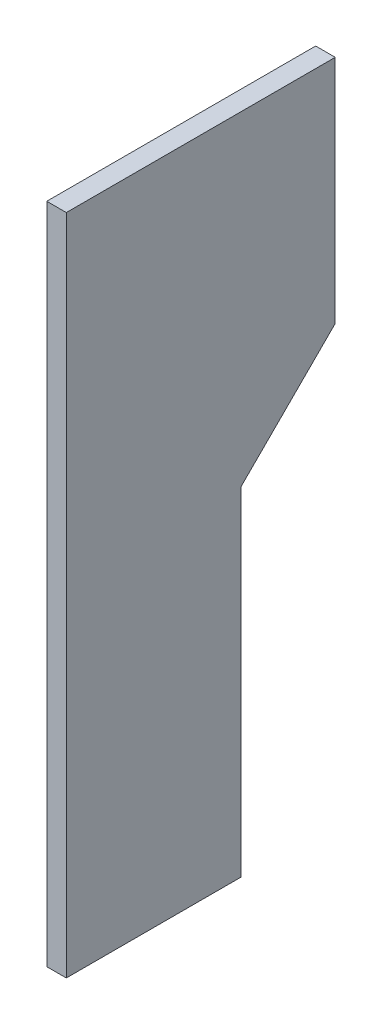
ISO-10303-21;
HEADER;
FILE_DESCRIPTION(('STEP AP214'),'2;1');
FILE_NAME('part.step','',(''),(''),'','','');
FILE_SCHEMA(('AUTOMOTIVE_DESIGN { 1 0 10303 214 1 1 1 1 }'));
ENDSEC;
DATA;
#1=APPLICATION_CONTEXT('core data for automotive mechanical design processes');
#2=APPLICATION_PROTOCOL_DEFINITION('international standard','automotive_design',2000,#1);
#3=PRODUCT_CONTEXT('',#1,'mechanical');
#4=PRODUCT('Part','Part','',(#3));
#5=PRODUCT_RELATED_PRODUCT_CATEGORY('part','',(#4));
#6=PRODUCT_DEFINITION_FORMATION('','',#4);
#7=PRODUCT_DEFINITION_CONTEXT('part definition',#1,'design');
#8=PRODUCT_DEFINITION('design','',#6,#7);
#9=PRODUCT_DEFINITION_SHAPE('','',#8);
#10=(LENGTH_UNIT() NAMED_UNIT(*) SI_UNIT(.MILLI.,.METRE.));
#11=(NAMED_UNIT(*) PLANE_ANGLE_UNIT() SI_UNIT($,.RADIAN.));
#12=(NAMED_UNIT(*) SI_UNIT($,.STERADIAN.) SOLID_ANGLE_UNIT());
#13=UNCERTAINTY_MEASURE_WITH_UNIT(LENGTH_MEASURE(1.E-05),#10,'distance_accuracy_value','');
#14=(GEOMETRIC_REPRESENTATION_CONTEXT(3) GLOBAL_UNCERTAINTY_ASSIGNED_CONTEXT((#13)) GLOBAL_UNIT_ASSIGNED_CONTEXT((#10,
#11,#12)) REPRESENTATION_CONTEXT('',''));
#15=CARTESIAN_POINT('',(0.,0.,0.));
#16=DIRECTION('',(0.,0.,1.));
#17=DIRECTION('',(1.,0.,0.));
#18=AXIS2_PLACEMENT_3D('',#15,#16,#17);
#19=CARTESIAN_POINT('',(-1342.,571.,160.));
#20=DIRECTION('',(-1.,0.,0.));
#21=DIRECTION('',(0.,0.,-1.));
#22=AXIS2_PLACEMENT_3D('',#19,#20,#21);
#23=PLANE('',#22);
#24=DIRECTION('',(0.,0.,-1.));
#25=VECTOR('',#24,1.);
#26=CARTESIAN_POINT('',(-1342.,571.,545.));
#27=LINE('',#26,#25);
#28=CARTESIAN_POINT('',(-1342.,571.,545.));
#29=VERTEX_POINT('',#28);
#30=CARTESIAN_POINT('',(-1342.,571.,160.));
#31=VERTEX_POINT('',#30);
#32=EDGE_CURVE('E82',#29,#31,#27,.T.);
#33=ORIENTED_EDGE('',*,*,#32,.F.);
#34=DIRECTION('',(0.,1.,0.));
#35=VECTOR('',#34,1.);
#36=CARTESIAN_POINT('',(-1342.,-378.,545.));
#37=LINE('',#36,#35);
#38=CARTESIAN_POINT('',(-1342.,-378.,545.));
#39=VERTEX_POINT('',#38);
#40=EDGE_CURVE('E36',#39,#29,#37,.T.);
#41=ORIENTED_EDGE('',*,*,#40,.F.);
#42=DIRECTION('',(0.,0.,1.));
#43=VECTOR('',#42,1.);
#44=CARTESIAN_POINT('',(-1342.,-378.,295.));
#45=LINE('',#44,#43);
#46=CARTESIAN_POINT('',(-1342.,-378.,295.));
#47=VERTEX_POINT('',#46);
#48=EDGE_CURVE('E95',#47,#39,#45,.T.);
#49=ORIENTED_EDGE('',*,*,#48,.F.);
#50=DIRECTION('',(0.,-1.,0.));
#51=VECTOR('',#50,1.);
#52=CARTESIAN_POINT('',(-1342.,106.,295.));
#53=LINE('',#52,#51);
#54=CARTESIAN_POINT('',(-1342.,106.,295.));
#55=VERTEX_POINT('',#54);
#56=EDGE_CURVE('E106',#55,#47,#53,.T.);
#57=ORIENTED_EDGE('',*,*,#56,.F.);
#58=DIRECTION('',(0.,-0.707106781186548,0.707106781186548));
#59=VECTOR('',#58,1.);
#60=CARTESIAN_POINT('',(-1342.,241.,160.));
#61=LINE('',#60,#59);
#62=CARTESIAN_POINT('',(-1342.,241.,160.));
#63=VERTEX_POINT('',#62);
#64=EDGE_CURVE('E98',#63,#55,#61,.T.);
#65=ORIENTED_EDGE('',*,*,#64,.F.);
#66=DIRECTION('',(0.,-1.,0.));
#67=VECTOR('',#66,1.);
#68=CARTESIAN_POINT('',(-1342.,571.,160.));
#69=LINE('',#68,#67);
#70=EDGE_CURVE('E27',#31,#63,#69,.T.);
#71=ORIENTED_EDGE('',*,*,#70,.F.);
#72=EDGE_LOOP('',(#33,#41,#49,#57,#65,#71));
#73=FACE_BOUND('',#72,.T.);
#74=ADVANCED_FACE('F17',(#73),#23,.F.);
#75=CARTESIAN_POINT('',(-1342.,571.,160.));
#76=DIRECTION('',(0.,0.,-1.));
#77=DIRECTION('',(-1.,0.,0.));
#78=AXIS2_PLACEMENT_3D('',#75,#76,#77);
#79=PLANE('',#78);
#80=DIRECTION('',(-1.,0.,0.));
#81=VECTOR('',#80,1.);
#82=CARTESIAN_POINT('',(-1342.,241.,160.));
#83=LINE('',#82,#81);
#84=CARTESIAN_POINT('',(-1370.,241.,160.));
#85=VERTEX_POINT('',#84);
#86=EDGE_CURVE('E11',#63,#85,#83,.T.);
#87=ORIENTED_EDGE('',*,*,#86,.T.);
#88=DIRECTION('',(0.,-1.,0.));
#89=VECTOR('',#88,1.);
#90=CARTESIAN_POINT('',(-1370.,571.,160.));
#91=LINE('',#90,#89);
#92=CARTESIAN_POINT('',(-1370.,571.,160.));
#93=VERTEX_POINT('',#92);
#94=EDGE_CURVE('E78',#93,#85,#91,.T.);
#95=ORIENTED_EDGE('',*,*,#94,.F.);
#96=DIRECTION('',(-1.,0.,0.));
#97=VECTOR('',#96,1.);
#98=CARTESIAN_POINT('',(-1342.,571.,160.));
#99=LINE('',#98,#97);
#100=EDGE_CURVE('E74',#31,#93,#99,.T.);
#101=ORIENTED_EDGE('',*,*,#100,.F.);
#102=ORIENTED_EDGE('',*,*,#70,.T.);
#103=EDGE_LOOP('',(#87,#95,#101,#102));
#104=FACE_BOUND('',#103,.T.);
#105=ADVANCED_FACE('F19',(#104),#79,.T.);
#106=CARTESIAN_POINT('',(-1342.,571.,545.));
#107=DIRECTION('',(0.,1.,0.));
#108=DIRECTION('',(0.,0.,1.));
#109=AXIS2_PLACEMENT_3D('',#106,#107,#108);
#110=PLANE('',#109);
#111=ORIENTED_EDGE('',*,*,#100,.T.);
#112=DIRECTION('',(0.,0.,-1.));
#113=VECTOR('',#112,1.);
#114=CARTESIAN_POINT('',(-1370.,571.,545.));
#115=LINE('',#114,#113);
#116=CARTESIAN_POINT('',(-1370.,571.,545.));
#117=VERTEX_POINT('',#116);
#118=EDGE_CURVE('E70',#117,#93,#115,.T.);
#119=ORIENTED_EDGE('',*,*,#118,.F.);
#120=DIRECTION('',(-1.,0.,0.));
#121=VECTOR('',#120,1.);
#122=CARTESIAN_POINT('',(-1342.,571.,545.));
#123=LINE('',#122,#121);
#124=EDGE_CURVE('E72',#29,#117,#123,.T.);
#125=ORIENTED_EDGE('',*,*,#124,.F.);
#126=ORIENTED_EDGE('',*,*,#32,.T.);
#127=EDGE_LOOP('',(#111,#119,#125,#126));
#128=FACE_BOUND('',#127,.T.);
#129=ADVANCED_FACE('F71',(#128),#110,.T.);
#130=CARTESIAN_POINT('',(-1342.,-378.,545.));
#131=DIRECTION('',(0.,0.,1.));
#132=DIRECTION('',(0.,1.,0.));
#133=AXIS2_PLACEMENT_3D('',#130,#131,#132);
#134=PLANE('',#133);
#135=ORIENTED_EDGE('',*,*,#124,.T.);
#136=DIRECTION('',(0.,1.,0.));
#137=VECTOR('',#136,1.);
#138=CARTESIAN_POINT('',(-1370.,-378.,545.));
#139=LINE('',#138,#137);
#140=CARTESIAN_POINT('',(-1370.,-378.,545.));
#141=VERTEX_POINT('',#140);
#142=EDGE_CURVE('E77',#141,#117,#139,.T.);
#143=ORIENTED_EDGE('',*,*,#142,.F.);
#144=DIRECTION('',(-1.,0.,0.));
#145=VECTOR('',#144,1.);
#146=CARTESIAN_POINT('',(-1342.,-378.,545.));
#147=LINE('',#146,#145);
#148=EDGE_CURVE('E93',#39,#141,#147,.T.);
#149=ORIENTED_EDGE('',*,*,#148,.F.);
#150=ORIENTED_EDGE('',*,*,#40,.T.);
#151=EDGE_LOOP('',(#135,#143,#149,#150));
#152=FACE_BOUND('',#151,.T.);
#153=ADVANCED_FACE('F80',(#152),#134,.T.);
#154=CARTESIAN_POINT('',(-1342.,-378.,295.));
#155=DIRECTION('',(0.,-1.,0.));
#156=DIRECTION('',(-1.,0.,0.));
#157=AXIS2_PLACEMENT_3D('',#154,#155,#156);
#158=PLANE('',#157);
#159=ORIENTED_EDGE('',*,*,#148,.T.);
#160=DIRECTION('',(0.,0.,1.));
#161=VECTOR('',#160,1.);
#162=CARTESIAN_POINT('',(-1370.,-378.,295.));
#163=LINE('',#162,#161);
#164=CARTESIAN_POINT('',(-1370.,-378.,295.));
#165=VERTEX_POINT('',#164);
#166=EDGE_CURVE('E89',#165,#141,#163,.T.);
#167=ORIENTED_EDGE('',*,*,#166,.F.);
#168=DIRECTION('',(-1.,0.,0.));
#169=VECTOR('',#168,1.);
#170=CARTESIAN_POINT('',(-1342.,-378.,295.));
#171=LINE('',#170,#169);
#172=EDGE_CURVE('E100',#47,#165,#171,.T.);
#173=ORIENTED_EDGE('',*,*,#172,.F.);
#174=ORIENTED_EDGE('',*,*,#48,.T.);
#175=EDGE_LOOP('',(#159,#167,#173,#174));
#176=FACE_BOUND('',#175,.T.);
#177=ADVANCED_FACE('F126',(#176),#158,.T.);
#178=CARTESIAN_POINT('',(-1342.,106.,295.));
#179=DIRECTION('',(0.,0.,-1.));
#180=DIRECTION('',(-1.,0.,0.));
#181=AXIS2_PLACEMENT_3D('',#178,#179,#180);
#182=PLANE('',#181);
#183=ORIENTED_EDGE('',*,*,#172,.T.);
#184=DIRECTION('',(0.,-1.,0.));
#185=VECTOR('',#184,1.);
#186=CARTESIAN_POINT('',(-1370.,106.,295.));
#187=LINE('',#186,#185);
#188=CARTESIAN_POINT('',(-1370.,106.,295.));
#189=VERTEX_POINT('',#188);
#190=EDGE_CURVE('E21',#189,#165,#187,.T.);
#191=ORIENTED_EDGE('',*,*,#190,.F.);
#192=DIRECTION('',(-1.,0.,0.));
#193=VECTOR('',#192,1.);
#194=CARTESIAN_POINT('',(-1342.,106.,295.));
#195=LINE('',#194,#193);
#196=EDGE_CURVE('E103',#55,#189,#195,.T.);
#197=ORIENTED_EDGE('',*,*,#196,.F.);
#198=ORIENTED_EDGE('',*,*,#56,.T.);
#199=EDGE_LOOP('',(#183,#191,#197,#198));
#200=FACE_BOUND('',#199,.T.);
#201=ADVANCED_FACE('F124',(#200),#182,.T.);
#202=CARTESIAN_POINT('',(-1342.,241.,160.));
#203=DIRECTION('',(0.,-0.707106781186548,-0.707106781186548));
#204=DIRECTION('',(-1.,0.,0.));
#205=AXIS2_PLACEMENT_3D('',#202,#203,#204);
#206=PLANE('',#205);
#207=ORIENTED_EDGE('',*,*,#196,.T.);
#208=DIRECTION('',(0.,-0.707106781186548,0.707106781186548));
#209=VECTOR('',#208,1.);
#210=CARTESIAN_POINT('',(-1370.,241.,160.));
#211=LINE('',#210,#209);
#212=EDGE_CURVE('E96',#85,#189,#211,.T.);
#213=ORIENTED_EDGE('',*,*,#212,.F.);
#214=ORIENTED_EDGE('',*,*,#86,.F.);
#215=ORIENTED_EDGE('',*,*,#64,.T.);
#216=EDGE_LOOP('',(#207,#213,#214,#215));
#217=FACE_BOUND('',#216,.T.);
#218=ADVANCED_FACE('F116',(#217),#206,.T.);
#219=CARTESIAN_POINT('',(-1370.,571.,160.));
#220=DIRECTION('',(-1.,0.,0.));
#221=DIRECTION('',(0.,0.,-1.));
#222=AXIS2_PLACEMENT_3D('',#219,#220,#221);
#223=PLANE('',#222);
#224=ORIENTED_EDGE('',*,*,#212,.T.);
#225=ORIENTED_EDGE('',*,*,#190,.T.);
#226=ORIENTED_EDGE('',*,*,#166,.T.);
#227=ORIENTED_EDGE('',*,*,#142,.T.);
#228=ORIENTED_EDGE('',*,*,#118,.T.);
#229=ORIENTED_EDGE('',*,*,#94,.T.);
#230=EDGE_LOOP('',(#224,#225,#226,#227,#228,#229));
#231=FACE_BOUND('',#230,.T.);
#232=ADVANCED_FACE('F86',(#231),#223,.T.);
#233=CLOSED_SHELL('',(#74,#105,#129,#153,#177,#201,#218,#232));
#234=MANIFOLD_SOLID_BREP('B1',#233);
#235=ADVANCED_BREP_SHAPE_REPRESENTATION('',(#18,#234),#14);
#236=SHAPE_DEFINITION_REPRESENTATION(#9,#235);
ENDSEC;
END-ISO-10303-21;
